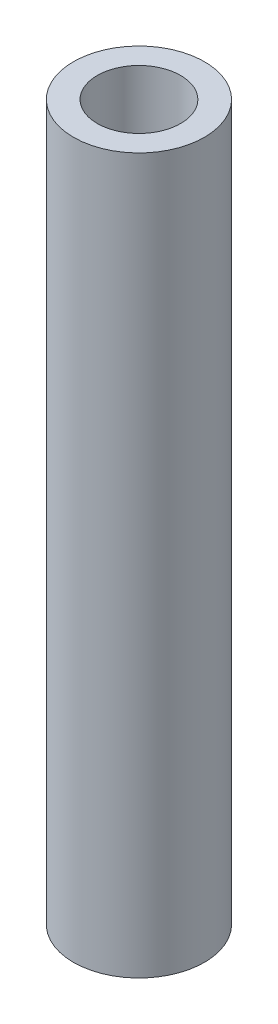
ISO-10303-21;
HEADER;
FILE_DESCRIPTION(('STEP AP214'),'2;1');
FILE_NAME('part.step','',(''),(''),'','','');
FILE_SCHEMA(('AUTOMOTIVE_DESIGN { 1 0 10303 214 1 1 1 1 }'));
ENDSEC;
DATA;
#1=APPLICATION_CONTEXT('core data for automotive mechanical design processes');
#2=APPLICATION_PROTOCOL_DEFINITION('international standard','automotive_design',2000,#1);
#3=PRODUCT_CONTEXT('',#1,'mechanical');
#4=PRODUCT('Part','Part','',(#3));
#5=PRODUCT_RELATED_PRODUCT_CATEGORY('part','',(#4));
#6=PRODUCT_DEFINITION_FORMATION('','',#4);
#7=PRODUCT_DEFINITION_CONTEXT('part definition',#1,'design');
#8=PRODUCT_DEFINITION('design','',#6,#7);
#9=PRODUCT_DEFINITION_SHAPE('','',#8);
#10=(LENGTH_UNIT() NAMED_UNIT(*) SI_UNIT(.MILLI.,.METRE.));
#11=(NAMED_UNIT(*) PLANE_ANGLE_UNIT() SI_UNIT($,.RADIAN.));
#12=(NAMED_UNIT(*) SI_UNIT($,.STERADIAN.) SOLID_ANGLE_UNIT());
#13=UNCERTAINTY_MEASURE_WITH_UNIT(LENGTH_MEASURE(1.E-05),#10,'distance_accuracy_value','');
#14=(GEOMETRIC_REPRESENTATION_CONTEXT(3) GLOBAL_UNCERTAINTY_ASSIGNED_CONTEXT((#13)) GLOBAL_UNIT_ASSIGNED_CONTEXT((#10,
#11,#12)) REPRESENTATION_CONTEXT('',''));
#15=CARTESIAN_POINT('',(0.,0.,0.));
#16=DIRECTION('',(0.,0.,1.));
#17=DIRECTION('',(1.,0.,0.));
#18=AXIS2_PLACEMENT_3D('',#15,#16,#17);
#19=CARTESIAN_POINT('',(0.,30.,0.));
#20=DIRECTION('',(0.,1.,0.));
#21=DIRECTION('',(0.,0.,1.));
#22=AXIS2_PLACEMENT_3D('',#19,#20,#21);
#23=PLANE('',#22);
#24=CARTESIAN_POINT('',(0.,30.,0.));
#25=DIRECTION('',(0.,1.,0.));
#26=DIRECTION('',(0.,0.,1.));
#27=AXIS2_PLACEMENT_3D('',#24,#25,#26);
#28=CIRCLE('',#27,2.75);
#29=CARTESIAN_POINT('',(0.,30.,2.75));
#30=VERTEX_POINT('',#29);
#31=EDGE_CURVE('E10',#30,#30,#28,.T.);
#32=ORIENTED_EDGE('',*,*,#31,.T.);
#33=EDGE_LOOP('',(#32));
#34=FACE_BOUND('',#33,.T.);
#35=CARTESIAN_POINT('',(0.,30.,0.));
#36=DIRECTION('',(0.,1.,0.));
#37=DIRECTION('',(0.,0.,1.));
#38=AXIS2_PLACEMENT_3D('',#35,#36,#37);
#39=CIRCLE('',#38,1.75);
#40=CARTESIAN_POINT('',(0.,30.,1.75));
#41=VERTEX_POINT('',#40);
#42=EDGE_CURVE('E41',#41,#41,#39,.T.);
#43=ORIENTED_EDGE('',*,*,#42,.F.);
#44=EDGE_LOOP('',(#43));
#45=FACE_BOUND('',#44,.T.);
#46=ADVANCED_FACE('F30',(#34,#45),#23,.T.);
#47=CARTESIAN_POINT('',(0.,0.,0.));
#48=DIRECTION('',(0.,1.,0.));
#49=DIRECTION('',(0.,0.,1.));
#50=AXIS2_PLACEMENT_3D('',#47,#48,#49);
#51=PLANE('',#50);
#52=CARTESIAN_POINT('',(0.,0.,0.));
#53=DIRECTION('',(0.,1.,0.));
#54=DIRECTION('',(0.,0.,1.));
#55=AXIS2_PLACEMENT_3D('',#52,#53,#54);
#56=CIRCLE('',#55,2.75);
#57=CARTESIAN_POINT('',(0.,0.,2.75));
#58=VERTEX_POINT('',#57);
#59=EDGE_CURVE('E34',#58,#58,#56,.T.);
#60=ORIENTED_EDGE('',*,*,#59,.F.);
#61=EDGE_LOOP('',(#60));
#62=FACE_BOUND('',#61,.T.);
#63=CARTESIAN_POINT('',(0.,0.,0.));
#64=DIRECTION('',(0.,1.,0.));
#65=DIRECTION('',(0.,0.,1.));
#66=AXIS2_PLACEMENT_3D('',#63,#64,#65);
#67=CIRCLE('',#66,1.75);
#68=CARTESIAN_POINT('',(0.,0.,1.75));
#69=VERTEX_POINT('',#68);
#70=EDGE_CURVE('E43',#69,#69,#67,.T.);
#71=ORIENTED_EDGE('',*,*,#70,.T.);
#72=EDGE_LOOP('',(#71));
#73=FACE_BOUND('',#72,.T.);
#74=ADVANCED_FACE('F53',(#62,#73),#51,.F.);
#75=CARTESIAN_POINT('',(0.,30.,0.));
#76=DIRECTION('',(0.,-1.,0.));
#77=DIRECTION('',(0.,0.,-1.));
#78=AXIS2_PLACEMENT_3D('',#75,#76,#77);
#79=CYLINDRICAL_SURFACE('',#78,2.75);
#80=ORIENTED_EDGE('',*,*,#31,.F.);
#81=EDGE_LOOP('',(#80));
#82=FACE_BOUND('',#81,.T.);
#83=ORIENTED_EDGE('',*,*,#59,.T.);
#84=EDGE_LOOP('',(#83));
#85=FACE_BOUND('',#84,.T.);
#86=ADVANCED_FACE('F32',(#82,#85),#79,.T.);
#87=CARTESIAN_POINT('',(0.,30.,0.));
#88=DIRECTION('',(0.,-1.,0.));
#89=DIRECTION('',(0.,0.,-1.));
#90=AXIS2_PLACEMENT_3D('',#87,#88,#89);
#91=CYLINDRICAL_SURFACE('',#90,1.75);
#92=ORIENTED_EDGE('',*,*,#42,.T.);
#93=EDGE_LOOP('',(#92));
#94=FACE_BOUND('',#93,.T.);
#95=ORIENTED_EDGE('',*,*,#70,.F.);
#96=EDGE_LOOP('',(#95));
#97=FACE_BOUND('',#96,.T.);
#98=ADVANCED_FACE('F49',(#94,#97),#91,.F.);
#99=CLOSED_SHELL('',(#46,#74,#86,#98));
#100=MANIFOLD_SOLID_BREP('B2',#99);
#101=ADVANCED_BREP_SHAPE_REPRESENTATION('',(#18,#100),#14);
#102=SHAPE_DEFINITION_REPRESENTATION(#9,#101);
ENDSEC;
END-ISO-10303-21;
